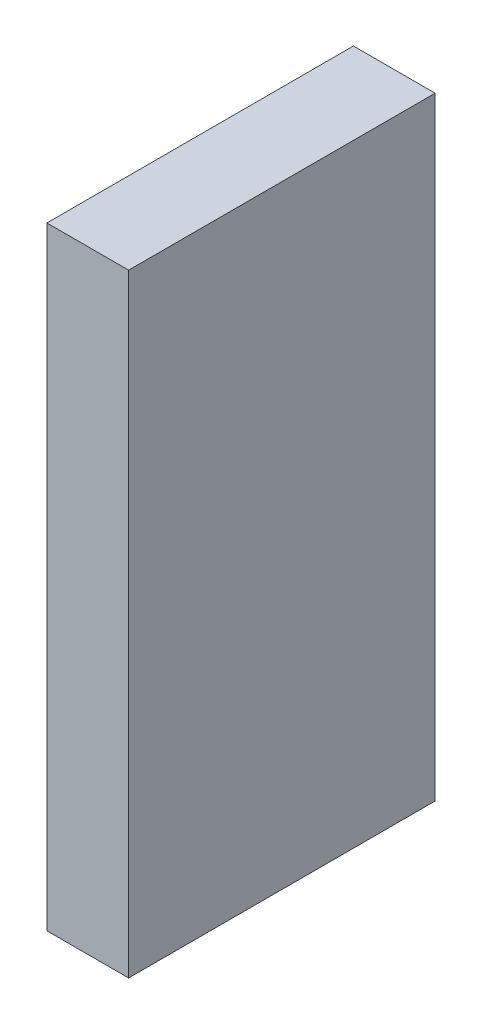
ISO-10303-21;
HEADER;
FILE_DESCRIPTION(('STEP AP214'),'2;1');
FILE_NAME('part.step','',(''),(''),'','','');
FILE_SCHEMA(('AUTOMOTIVE_DESIGN { 1 0 10303 214 1 1 1 1 }'));
ENDSEC;
DATA;
#1=APPLICATION_CONTEXT('core data for automotive mechanical design processes');
#2=APPLICATION_PROTOCOL_DEFINITION('international standard','automotive_design',2000,#1);
#3=PRODUCT_CONTEXT('',#1,'mechanical');
#4=PRODUCT('Part','Part','',(#3));
#5=PRODUCT_RELATED_PRODUCT_CATEGORY('part','',(#4));
#6=PRODUCT_DEFINITION_FORMATION('','',#4);
#7=PRODUCT_DEFINITION_CONTEXT('part definition',#1,'design');
#8=PRODUCT_DEFINITION('design','',#6,#7);
#9=PRODUCT_DEFINITION_SHAPE('','',#8);
#10=(LENGTH_UNIT() NAMED_UNIT(*) SI_UNIT(.MILLI.,.METRE.));
#11=(NAMED_UNIT(*) PLANE_ANGLE_UNIT() SI_UNIT($,.RADIAN.));
#12=(NAMED_UNIT(*) SI_UNIT($,.STERADIAN.) SOLID_ANGLE_UNIT());
#13=UNCERTAINTY_MEASURE_WITH_UNIT(LENGTH_MEASURE(1.E-05),#10,'distance_accuracy_value','');
#14=(GEOMETRIC_REPRESENTATION_CONTEXT(3) GLOBAL_UNCERTAINTY_ASSIGNED_CONTEXT((#13)) GLOBAL_UNIT_ASSIGNED_CONTEXT((#10,
#11,#12)) REPRESENTATION_CONTEXT('',''));
#15=CARTESIAN_POINT('',(0.,0.,0.));
#16=DIRECTION('',(0.,0.,1.));
#17=DIRECTION('',(1.,0.,0.));
#18=AXIS2_PLACEMENT_3D('',#15,#16,#17);
#19=CARTESIAN_POINT('',(546.,700.,-215.));
#20=DIRECTION('',(-1.,0.,0.));
#21=DIRECTION('',(0.,0.,1.));
#22=AXIS2_PLACEMENT_3D('',#19,#20,#21);
#23=PLANE('',#22);
#24=DIRECTION('',(0.,-1.,0.));
#25=VECTOR('',#24,1.);
#26=CARTESIAN_POINT('',(546.,700.,-185.));
#27=LINE('',#26,#25);
#28=CARTESIAN_POINT('',(546.,760.,-185.));
#29=VERTEX_POINT('',#28);
#30=CARTESIAN_POINT('',(546.,700.,-185.));
#31=VERTEX_POINT('',#30);
#32=EDGE_CURVE('E103',#29,#31,#27,.T.);
#33=ORIENTED_EDGE('',*,*,#32,.F.);
#34=DIRECTION('',(0.,0.,1.));
#35=VECTOR('',#34,1.);
#36=CARTESIAN_POINT('',(546.,760.,-215.));
#37=LINE('',#36,#35);
#38=CARTESIAN_POINT('',(546.,760.,-215.));
#39=VERTEX_POINT('',#38);
#40=EDGE_CURVE('E11',#39,#29,#37,.T.);
#41=ORIENTED_EDGE('',*,*,#40,.F.);
#42=DIRECTION('',(0.,-1.,0.));
#43=VECTOR('',#42,1.);
#44=CARTESIAN_POINT('',(546.,700.,-215.));
#45=LINE('',#44,#43);
#46=CARTESIAN_POINT('',(546.,700.,-215.));
#47=VERTEX_POINT('',#46);
#48=EDGE_CURVE('E97',#39,#47,#45,.T.);
#49=ORIENTED_EDGE('',*,*,#48,.T.);
#50=DIRECTION('',(0.,0.,1.));
#51=VECTOR('',#50,1.);
#52=CARTESIAN_POINT('',(546.,700.,-215.));
#53=LINE('',#52,#51);
#54=EDGE_CURVE('E42',#47,#31,#53,.T.);
#55=ORIENTED_EDGE('',*,*,#54,.T.);
#56=EDGE_LOOP('',(#33,#41,#49,#55));
#57=FACE_BOUND('',#56,.T.);
#58=ADVANCED_FACE('F39',(#57),#23,.T.);
#59=CARTESIAN_POINT('',(546.,760.,-215.));
#60=DIRECTION('',(0.,1.,0.));
#61=DIRECTION('',(0.,0.,1.));
#62=AXIS2_PLACEMENT_3D('',#59,#60,#61);
#63=PLANE('',#62);
#64=DIRECTION('',(-1.,0.,0.));
#65=VECTOR('',#64,1.);
#66=CARTESIAN_POINT('',(546.,760.,-185.));
#67=LINE('',#66,#65);
#68=CARTESIAN_POINT('',(554.,760.,-185.));
#69=VERTEX_POINT('',#68);
#70=EDGE_CURVE('E99',#69,#29,#67,.T.);
#71=ORIENTED_EDGE('',*,*,#70,.F.);
#72=DIRECTION('',(0.,0.,1.));
#73=VECTOR('',#72,1.);
#74=CARTESIAN_POINT('',(554.,760.,-215.));
#75=LINE('',#74,#73);
#76=CARTESIAN_POINT('',(554.,760.,-215.));
#77=VERTEX_POINT('',#76);
#78=EDGE_CURVE('E48',#77,#69,#75,.T.);
#79=ORIENTED_EDGE('',*,*,#78,.F.);
#80=DIRECTION('',(-1.,0.,0.));
#81=VECTOR('',#80,1.);
#82=CARTESIAN_POINT('',(546.,760.,-215.));
#83=LINE('',#82,#81);
#84=EDGE_CURVE('E94',#77,#39,#83,.T.);
#85=ORIENTED_EDGE('',*,*,#84,.T.);
#86=ORIENTED_EDGE('',*,*,#40,.T.);
#87=EDGE_LOOP('',(#71,#79,#85,#86));
#88=FACE_BOUND('',#87,.T.);
#89=ADVANCED_FACE('F113',(#88),#63,.T.);
#90=CARTESIAN_POINT('',(554.,700.,-215.));
#91=DIRECTION('',(1.,0.,0.));
#92=DIRECTION('',(0.,0.,-1.));
#93=AXIS2_PLACEMENT_3D('',#90,#91,#92);
#94=PLANE('',#93);
#95=DIRECTION('',(0.,1.,0.));
#96=VECTOR('',#95,1.);
#97=CARTESIAN_POINT('',(554.,700.,-185.));
#98=LINE('',#97,#96);
#99=CARTESIAN_POINT('',(554.,700.,-185.));
#100=VERTEX_POINT('',#99);
#101=EDGE_CURVE('E89',#100,#69,#98,.T.);
#102=ORIENTED_EDGE('',*,*,#101,.F.);
#103=DIRECTION('',(0.,0.,1.));
#104=VECTOR('',#103,1.);
#105=CARTESIAN_POINT('',(554.,700.,-215.));
#106=LINE('',#105,#104);
#107=CARTESIAN_POINT('',(554.,700.,-215.));
#108=VERTEX_POINT('',#107);
#109=EDGE_CURVE('E84',#108,#100,#106,.T.);
#110=ORIENTED_EDGE('',*,*,#109,.F.);
#111=DIRECTION('',(0.,1.,0.));
#112=VECTOR('',#111,1.);
#113=CARTESIAN_POINT('',(554.,700.,-215.));
#114=LINE('',#113,#112);
#115=EDGE_CURVE('E87',#108,#77,#114,.T.);
#116=ORIENTED_EDGE('',*,*,#115,.T.);
#117=ORIENTED_EDGE('',*,*,#78,.T.);
#118=EDGE_LOOP('',(#102,#110,#116,#117));
#119=FACE_BOUND('',#118,.T.);
#120=ADVANCED_FACE('F86',(#119),#94,.T.);
#121=CARTESIAN_POINT('',(546.,700.,-215.));
#122=DIRECTION('',(0.,-1.,0.));
#123=DIRECTION('',(0.,0.,-1.));
#124=AXIS2_PLACEMENT_3D('',#121,#122,#123);
#125=PLANE('',#124);
#126=DIRECTION('',(1.,0.,0.));
#127=VECTOR('',#126,1.);
#128=CARTESIAN_POINT('',(546.,700.,-185.));
#129=LINE('',#128,#127);
#130=EDGE_CURVE('E106',#31,#100,#129,.T.);
#131=ORIENTED_EDGE('',*,*,#130,.F.);
#132=ORIENTED_EDGE('',*,*,#54,.F.);
#133=DIRECTION('',(1.,0.,0.));
#134=VECTOR('',#133,1.);
#135=CARTESIAN_POINT('',(546.,700.,-215.));
#136=LINE('',#135,#134);
#137=EDGE_CURVE('E93',#47,#108,#136,.T.);
#138=ORIENTED_EDGE('',*,*,#137,.T.);
#139=ORIENTED_EDGE('',*,*,#109,.T.);
#140=EDGE_LOOP('',(#131,#132,#138,#139));
#141=FACE_BOUND('',#140,.T.);
#142=ADVANCED_FACE('F96',(#141),#125,.T.);
#143=CARTESIAN_POINT('',(0.,0.,-215.));
#144=DIRECTION('',(0.,0.,-1.));
#145=DIRECTION('',(-1.,0.,0.));
#146=AXIS2_PLACEMENT_3D('',#143,#144,#145);
#147=PLANE('',#146);
#148=ORIENTED_EDGE('',*,*,#48,.F.);
#149=ORIENTED_EDGE('',*,*,#84,.F.);
#150=ORIENTED_EDGE('',*,*,#115,.F.);
#151=ORIENTED_EDGE('',*,*,#137,.F.);
#152=EDGE_LOOP('',(#148,#149,#150,#151));
#153=FACE_BOUND('',#152,.T.);
#154=ADVANCED_FACE('F92',(#153),#147,.T.);
#155=CARTESIAN_POINT('',(0.,0.,-185.));
#156=DIRECTION('',(0.,0.,-1.));
#157=DIRECTION('',(-1.,0.,0.));
#158=AXIS2_PLACEMENT_3D('',#155,#156,#157);
#159=PLANE('',#158);
#160=ORIENTED_EDGE('',*,*,#32,.T.);
#161=ORIENTED_EDGE('',*,*,#130,.T.);
#162=ORIENTED_EDGE('',*,*,#101,.T.);
#163=ORIENTED_EDGE('',*,*,#70,.T.);
#164=EDGE_LOOP('',(#160,#161,#162,#163));
#165=FACE_BOUND('',#164,.T.);
#166=ADVANCED_FACE('F112',(#165),#159,.F.);
#167=CLOSED_SHELL('',(#58,#89,#120,#142,#154,#166));
#168=MANIFOLD_SOLID_BREP('B2',#167);
#169=ADVANCED_BREP_SHAPE_REPRESENTATION('',(#18,#168),#14);
#170=SHAPE_DEFINITION_REPRESENTATION(#9,#169);
ENDSEC;
END-ISO-10303-21;
